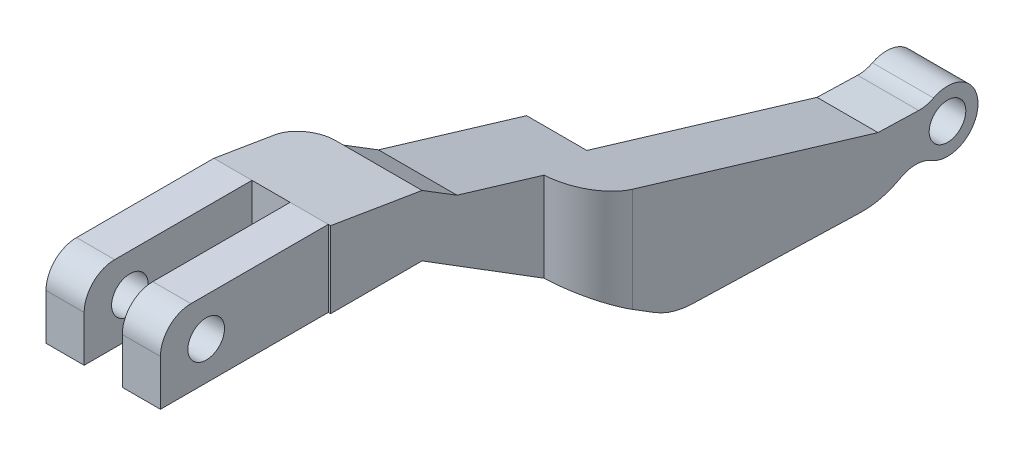
ISO-10303-21;
HEADER;
FILE_DESCRIPTION(('STEP AP214'),'2;1');
FILE_NAME('part.step','',(''),(''),'','','');
FILE_SCHEMA(('AUTOMOTIVE_DESIGN { 1 0 10303 214 1 1 1 1 }'));
ENDSEC;
DATA;
#1=APPLICATION_CONTEXT('core data for automotive mechanical design processes');
#2=APPLICATION_PROTOCOL_DEFINITION('international standard','automotive_design',2000,#1);
#3=PRODUCT_CONTEXT('',#1,'mechanical');
#4=PRODUCT('Part','Part','',(#3));
#5=PRODUCT_RELATED_PRODUCT_CATEGORY('part','',(#4));
#6=PRODUCT_DEFINITION_FORMATION('','',#4);
#7=PRODUCT_DEFINITION_CONTEXT('part definition',#1,'design');
#8=PRODUCT_DEFINITION('design','',#6,#7);
#9=PRODUCT_DEFINITION_SHAPE('','',#8);
#10=(LENGTH_UNIT() NAMED_UNIT(*) SI_UNIT(.MILLI.,.METRE.));
#11=(NAMED_UNIT(*) PLANE_ANGLE_UNIT() SI_UNIT($,.RADIAN.));
#12=(NAMED_UNIT(*) SI_UNIT($,.STERADIAN.) SOLID_ANGLE_UNIT());
#13=UNCERTAINTY_MEASURE_WITH_UNIT(LENGTH_MEASURE(1.E-05),#10,'distance_accuracy_value','');
#14=(GEOMETRIC_REPRESENTATION_CONTEXT(3) GLOBAL_UNCERTAINTY_ASSIGNED_CONTEXT((#13)) GLOBAL_UNIT_ASSIGNED_CONTEXT((#10,
#11,#12)) REPRESENTATION_CONTEXT('',''));
#15=CARTESIAN_POINT('',(0.,0.,0.));
#16=DIRECTION('',(0.,0.,1.));
#17=DIRECTION('',(1.,0.,0.));
#18=AXIS2_PLACEMENT_3D('',#15,#16,#17);
#19=CARTESIAN_POINT('',(-5.95,0.,0.));
#20=DIRECTION('',(-1.,0.,0.));
#21=DIRECTION('',(0.,0.,1.));
#22=AXIS2_PLACEMENT_3D('',#19,#20,#21);
#23=PLANE('',#22);
#24=DIRECTION('',(0.,-0.528778917000518,-0.848759599024223));
#25=VECTOR('',#24,1.);
#26=CARTESIAN_POINT('',(-5.95,-8.75515715939604,5.45448031013391));
#27=LINE('',#26,#25);
#28=CARTESIAN_POINT('',(-5.95,9.3176930361465,34.4637781320032));
#29=VERTEX_POINT('',#28);
#30=CARTESIAN_POINT('',(-5.95,4.69896609824937,27.0501148830047));
#31=VERTEX_POINT('',#30);
#32=EDGE_CURVE('E276',#29,#31,#27,.T.);
#33=ORIENTED_EDGE('',*,*,#32,.F.);
#34=DIRECTION('',(0.,1.,0.));
#35=VECTOR('',#34,1.);
#36=CARTESIAN_POINT('',(-5.95,0.,34.4637781320032));
#37=LINE('',#36,#35);
#38=CARTESIAN_POINT('',(-5.95,13.3176930361465,34.4637781320032));
#39=VERTEX_POINT('',#38);
#40=EDGE_CURVE('E523',#29,#39,#37,.T.);
#41=ORIENTED_EDGE('',*,*,#40,.T.);
#42=DIRECTION('',(0.,-0.525535679646446,-0.850771561242234));
#43=VECTOR('',#42,1.);
#44=CARTESIAN_POINT('',(-5.95,-5.76961842549239,3.56398882928632));
#45=LINE('',#44,#43);
#46=CARTESIAN_POINT('',(-5.95,11.9032897739303,32.1740495403473));
#47=VERTEX_POINT('',#46);
#48=EDGE_CURVE('E283',#39,#47,#45,.T.);
#49=ORIENTED_EDGE('',*,*,#48,.T.);
#50=DIRECTION('',(0.,-0.287432602525788,-0.957800866049542));
#51=VECTOR('',#50,1.);
#52=CARTESIAN_POINT('',(-5.95,11.9032897739303,32.1740495403473));
#53=LINE('',#52,#51);
#54=CARTESIAN_POINT('',(-5.95,8.98927217271034,22.4637781320032));
#55=VERTEX_POINT('',#54);
#56=EDGE_CURVE('E401',#47,#55,#53,.T.);
#57=ORIENTED_EDGE('',*,*,#56,.T.);
#58=DIRECTION('',(0.,-1.,0.));
#59=VECTOR('',#58,1.);
#60=CARTESIAN_POINT('',(-5.95,0.,22.4637781320032));
#61=LINE('',#60,#59);
#62=CARTESIAN_POINT('',(-5.95,7.24524489532204,22.4637781320032));
#63=VERTEX_POINT('',#62);
#64=EDGE_CURVE('E273',#55,#63,#61,.T.);
#65=ORIENTED_EDGE('',*,*,#64,.T.);
#66=CARTESIAN_POINT('',(-5.95,7.24524489532204,25.4637781320032));
#67=DIRECTION('',(-1.,0.,0.));
#68=DIRECTION('',(0.,0.,1.));
#69=AXIS2_PLACEMENT_3D('',#66,#67,#68);
#70=CIRCLE('',#69,3.);
#71=EDGE_CURVE('E424',#63,#31,#70,.T.);
#72=ORIENTED_EDGE('',*,*,#71,.T.);
#73=EDGE_LOOP('',(#33,#41,#49,#57,#65,#72));
#74=FACE_BOUND('',#73,.T.);
#75=ADVANCED_FACE('F45',(#74),#23,.T.);
#76=CARTESIAN_POINT('',(-2.,11.9032897739303,32.1740495403473));
#77=DIRECTION('',(0.,-0.957800866049542,0.287432602525788));
#78=DIRECTION('',(-1.,0.,0.));
#79=AXIS2_PLACEMENT_3D('',#76,#77,#78);
#80=PLANE('',#79);
#81=DIRECTION('',(0.,0.287432602525788,0.957800866049542));
#82=VECTOR('',#81,1.);
#83=CARTESIAN_POINT('',(-0.8,11.9032897739303,32.1740495403473));
#84=LINE('',#83,#82);
#85=CARTESIAN_POINT('',(-0.8,10.1896578174271,26.4637781320032));
#86=VERTEX_POINT('',#85);
#87=CARTESIAN_POINT('',(-0.8,11.9032897739303,32.1740495403473));
#88=VERTEX_POINT('',#87);
#89=EDGE_CURVE('E399',#86,#88,#84,.T.);
#90=ORIENTED_EDGE('',*,*,#89,.F.);
#91=CARTESIAN_POINT('',(-1.,9.29137145452073,23.470452222584));
#92=DIRECTION('',(0.,-0.957800866049542,0.287432602525788));
#93=DIRECTION('',(0.,0.287432602525788,0.957800866049542));
#94=AXIS2_PLACEMENT_3D('',#91,#92,#93);
#95=ELLIPSE('',#94,3.13217507557028,3.);
#96=CARTESIAN_POINT('',(2.,9.29137145452073,23.470452222584));
#97=VERTEX_POINT('',#96);
#98=EDGE_CURVE('E420',#86,#97,#95,.F.);
#99=ORIENTED_EDGE('',*,*,#98,.T.);
#100=DIRECTION('',(0.,0.287432602525788,0.957800866049542));
#101=VECTOR('',#100,1.);
#102=CARTESIAN_POINT('',(2.,11.9032897739303,32.1740495403473));
#103=LINE('',#102,#101);
#104=CARTESIAN_POINT('',(2.,4.46398660222472,7.3843389854166));
#105=VERTEX_POINT('',#104);
#106=EDGE_CURVE('E407',#97,#105,#103,.F.);
#107=ORIENTED_EDGE('',*,*,#106,.T.);
#108=DIRECTION('',(1.,0.,0.));
#109=VECTOR('',#108,1.);
#110=CARTESIAN_POINT('',(-2.,4.46398660222472,7.38433898541658));
#111=LINE('',#110,#109);
#112=CARTESIAN_POINT('',(-2.,4.46398660222472,7.3843389854166));
#113=VERTEX_POINT('',#112);
#114=EDGE_CURVE('E396',#113,#105,#111,.T.);
#115=ORIENTED_EDGE('',*,*,#114,.F.);
#116=DIRECTION('',(0.,-0.287432602525788,-0.957800866049542));
#117=VECTOR('',#116,1.);
#118=CARTESIAN_POINT('',(-2.,2.06225106437396,-0.61887414336909));
#119=LINE('',#118,#117);
#120=CARTESIAN_POINT('',(-2.,8.98927217271034,22.4637781320032));
#121=VERTEX_POINT('',#120);
#122=EDGE_CURVE('E409',#113,#121,#119,.F.);
#123=ORIENTED_EDGE('',*,*,#122,.T.);
#124=DIRECTION('',(1.,0.,0.));
#125=VECTOR('',#124,1.);
#126=CARTESIAN_POINT('',(-3.45,8.98927217271034,22.4637781320032));
#127=LINE('',#126,#125);
#128=EDGE_CURVE('E404',#55,#121,#127,.T.);
#129=ORIENTED_EDGE('',*,*,#128,.F.);
#130=ORIENTED_EDGE('',*,*,#56,.F.);
#131=DIRECTION('',(-1.,0.,0.));
#132=VECTOR('',#131,1.);
#133=CARTESIAN_POINT('',(-2.,11.9032897739303,32.1740495403473));
#134=LINE('',#133,#132);
#135=EDGE_CURVE('E393',#88,#47,#134,.T.);
#136=ORIENTED_EDGE('',*,*,#135,.F.);
#137=EDGE_LOOP('',(#90,#99,#107,#115,#123,#129,#130,#136));
#138=FACE_BOUND('',#137,.T.);
#139=ADVANCED_FACE('F532',(#138),#80,.F.);
#140=CARTESIAN_POINT('',(-2.,0.,0.));
#141=DIRECTION('',(1.,0.,0.));
#142=DIRECTION('',(0.,0.,-1.));
#143=AXIS2_PLACEMENT_3D('',#140,#141,#142);
#144=PLANE('',#143);
#145=CARTESIAN_POINT('',(-2.,2.82842712474617,2.82842712474621));
#146=DIRECTION('',(1.,0.,0.));
#147=DIRECTION('',(0.,0.,-1.));
#148=AXIS2_PLACEMENT_3D('',#145,#146,#147);
#149=CIRCLE('',#148,1.2);
#150=CARTESIAN_POINT('',(-2.,2.82842712474617,1.62842712474621));
#151=VERTEX_POINT('',#150);
#152=EDGE_CURVE('E381',#151,#151,#149,.T.);
#153=ORIENTED_EDGE('',*,*,#152,.T.);
#154=EDGE_LOOP('',(#153));
#155=FACE_BOUND('',#154,.T.);
#156=DIRECTION('',(0.,0.0297414685478298,0.999557624676346));
#157=VECTOR('',#156,1.);
#158=CARTESIAN_POINT('',(-2.,0.242283531335013,-0.00720905713584112));
#159=LINE('',#158,#157);
#160=CARTESIAN_POINT('',(-2.,0.496147983825629,8.52472166152389));
#161=VERTEX_POINT('',#160);
#162=CARTESIAN_POINT('',(-2.,0.824065904827044,19.5454571601043));
#163=VERTEX_POINT('',#162);
#164=EDGE_CURVE('E374',#161,#163,#159,.T.);
#165=ORIENTED_EDGE('',*,*,#164,.T.);
#166=CARTESIAN_POINT('',(-2.,5.82185402820877,19.3967498173651));
#167=DIRECTION('',(1.,0.,0.));
#168=DIRECTION('',(0.,0.,-1.));
#169=AXIS2_PLACEMENT_3D('',#166,#167,#168);
#170=CIRCLE('',#169,5.);
#171=CARTESIAN_POINT('',(-2.,1.57805603308766,22.0406444023677));
#172=VERTEX_POINT('',#171);
#173=EDGE_CURVE('E53',#163,#172,#170,.F.);
#174=ORIENTED_EDGE('',*,*,#173,.T.);
#175=DIRECTION('',(0.,-0.528778917000518,-0.848759599024223));
#176=VECTOR('',#175,1.);
#177=CARTESIAN_POINT('',(-2.,-8.75515715939604,5.45448031013391));
#178=LINE('',#177,#176);
#179=CARTESIAN_POINT('',(-2.,4.69896609824937,27.0501148830047));
#180=VERTEX_POINT('',#179);
#181=EDGE_CURVE('E371',#180,#172,#178,.T.);
#182=ORIENTED_EDGE('',*,*,#181,.F.);
#183=CARTESIAN_POINT('',(-2.,7.24524489532204,25.4637781320032));
#184=DIRECTION('',(1.,0.,0.));
#185=DIRECTION('',(0.,0.,-1.));
#186=AXIS2_PLACEMENT_3D('',#183,#184,#185);
#187=CIRCLE('',#186,3.);
#188=CARTESIAN_POINT('',(-2.,7.24524489532204,22.4637781320032));
#189=VERTEX_POINT('',#188);
#190=EDGE_CURVE('E426',#180,#189,#187,.T.);
#191=ORIENTED_EDGE('',*,*,#190,.T.);
#192=DIRECTION('',(0.,-1.,0.));
#193=VECTOR('',#192,1.);
#194=CARTESIAN_POINT('',(-2.,0.,22.4637781320032));
#195=LINE('',#194,#193);
#196=EDGE_CURVE('E387',#121,#189,#195,.T.);
#197=ORIENTED_EDGE('',*,*,#196,.F.);
#198=ORIENTED_EDGE('',*,*,#122,.F.);
#199=DIRECTION('',(0.,0.0297414685478318,0.999557624676346));
#200=VECTOR('',#199,1.);
#201=CARTESIAN_POINT('',(-2.,4.24051403004038,-0.126174931327168));
#202=LINE('',#201,#200);
#203=CARTESIAN_POINT('',(-2.,4.3847300535859,4.72066797771044));
#204=VERTEX_POINT('',#203);
#205=EDGE_CURVE('E368',#204,#113,#202,.T.);
#206=ORIENTED_EDGE('',*,*,#205,.F.);
#207=CARTESIAN_POINT('',(-2.,6.38384530293859,4.66118504061478));
#208=DIRECTION('',(1.,0.,0.));
#209=DIRECTION('',(0.,0.,-1.));
#210=AXIS2_PLACEMENT_3D('',#207,#208,#209);
#211=CIRCLE('',#210,2.);
#212=CARTESIAN_POINT('',(-2.,4.60613621384238,3.74480608268049));
#213=VERTEX_POINT('',#212);
#214=EDGE_CURVE('E366',#204,#213,#211,.T.);
#215=ORIENTED_EDGE('',*,*,#214,.T.);
#216=CARTESIAN_POINT('',(-2.,2.82842712474617,2.82842712474621));
#217=DIRECTION('',(1.,0.,0.));
#218=DIRECTION('',(0.,0.,-1.));
#219=AXIS2_PLACEMENT_3D('',#216,#217,#218);
#220=CIRCLE('',#219,2.);
#221=CARTESIAN_POINT('',(-2.,1.12045558993341,3.86901985788888));
#222=VERTEX_POINT('',#221);
#223=EDGE_CURVE('E378',#222,#213,#220,.T.);
#224=ORIENTED_EDGE('',*,*,#223,.F.);
#225=CARTESIAN_POINT('',(-2.,-0.587515944879356,4.90961259103154));
#226=DIRECTION('',(1.,0.,0.));
#227=DIRECTION('',(0.,0.,-1.));
#228=AXIS2_PLACEMENT_3D('',#225,#226,#227);
#229=CIRCLE('',#228,2.);
#230=CARTESIAN_POINT('',(-2.,1.15004178428828,5.90001308467531));
#231=VERTEX_POINT('',#230);
#232=EDGE_CURVE('E376',#222,#231,#229,.T.);
#233=ORIENTED_EDGE('',*,*,#232,.T.);
#234=CARTESIAN_POINT('',(-2.,5.49393610720736,8.37601431878474));
#235=DIRECTION('',(1.,0.,0.));
#236=DIRECTION('',(0.,0.,-1.));
#237=AXIS2_PLACEMENT_3D('',#234,#235,#236);
#238=CIRCLE('',#237,5.);
#239=EDGE_CURVE('E463',#231,#161,#238,.F.);
#240=ORIENTED_EDGE('',*,*,#239,.T.);
#241=EDGE_LOOP('',(#165,#174,#182,#191,#197,#198,#206,#215,#224,#233,#240));
#242=FACE_BOUND('',#241,.T.);
#243=ADVANCED_FACE('F466',(#155,#242),#144,.F.);
#244=CARTESIAN_POINT('',(-2.,6.38384530293859,4.66118504061478));
#245=DIRECTION('',(1.,0.,0.));
#246=DIRECTION('',(0.,0.,-1.));
#247=AXIS2_PLACEMENT_3D('',#244,#245,#246);
#248=CYLINDRICAL_SURFACE('',#247,2.);
#249=DIRECTION('',(1.,0.,0.));
#250=VECTOR('',#249,1.);
#251=CARTESIAN_POINT('',(-2.,4.3847300535859,4.72066797771044));
#252=LINE('',#251,#250);
#253=CARTESIAN_POINT('',(2.,4.3847300535859,4.72066797771044));
#254=VERTEX_POINT('',#253);
#255=EDGE_CURVE('E384',#204,#254,#252,.T.);
#256=ORIENTED_EDGE('',*,*,#255,.T.);
#257=CARTESIAN_POINT('',(2.,6.38384530293859,4.66118504061478));
#258=DIRECTION('',(1.,0.,0.));
#259=DIRECTION('',(0.,0.,-1.));
#260=AXIS2_PLACEMENT_3D('',#257,#258,#259);
#261=CIRCLE('',#260,2.);
#262=CARTESIAN_POINT('',(2.,4.60613621384238,3.74480608268049));
#263=VERTEX_POINT('',#262);
#264=EDGE_CURVE('E347',#254,#263,#261,.T.);
#265=ORIENTED_EDGE('',*,*,#264,.T.);
#266=DIRECTION('',(1.,0.,0.));
#267=VECTOR('',#266,1.);
#268=CARTESIAN_POINT('',(-2.,4.60613621384238,3.74480608268049));
#269=LINE('',#268,#267);
#270=EDGE_CURVE('E385',#213,#263,#269,.T.);
#271=ORIENTED_EDGE('',*,*,#270,.F.);
#272=ORIENTED_EDGE('',*,*,#214,.F.);
#273=EDGE_LOOP('',(#256,#265,#271,#272));
#274=FACE_BOUND('',#273,.T.);
#275=ADVANCED_FACE('F492',(#274),#248,.F.);
#276=CARTESIAN_POINT('',(-2.,2.82842712474617,2.82842712474621));
#277=DIRECTION('',(1.,0.,0.));
#278=DIRECTION('',(0.,0.,-1.));
#279=AXIS2_PLACEMENT_3D('',#276,#277,#278);
#280=CYLINDRICAL_SURFACE('',#279,2.);
#281=ORIENTED_EDGE('',*,*,#270,.T.);
#282=CARTESIAN_POINT('',(2.,2.82842712474617,2.82842712474621));
#283=DIRECTION('',(1.,0.,0.));
#284=DIRECTION('',(0.,0.,-1.));
#285=AXIS2_PLACEMENT_3D('',#282,#283,#284);
#286=CIRCLE('',#285,2.);
#287=CARTESIAN_POINT('',(2.,1.12045558993341,3.86901985788888));
#288=VERTEX_POINT('',#287);
#289=EDGE_CURVE('E360',#288,#263,#286,.T.);
#290=ORIENTED_EDGE('',*,*,#289,.F.);
#291=DIRECTION('',(1.,0.,0.));
#292=VECTOR('',#291,1.);
#293=CARTESIAN_POINT('',(-2.,1.12045558993341,3.86901985788888));
#294=LINE('',#293,#292);
#295=EDGE_CURVE('E388',#222,#288,#294,.T.);
#296=ORIENTED_EDGE('',*,*,#295,.F.);
#297=ORIENTED_EDGE('',*,*,#223,.T.);
#298=EDGE_LOOP('',(#281,#290,#296,#297));
#299=FACE_BOUND('',#298,.T.);
#300=ADVANCED_FACE('F488',(#299),#280,.T.);
#301=CARTESIAN_POINT('',(-2.,-0.587515944879356,4.90961259103154));
#302=DIRECTION('',(1.,0.,0.));
#303=DIRECTION('',(0.,0.,-1.));
#304=AXIS2_PLACEMENT_3D('',#301,#302,#303);
#305=CYLINDRICAL_SURFACE('',#304,2.);
#306=CARTESIAN_POINT('',(2.,-0.587515944879356,4.90961259103154));
#307=DIRECTION('',(1.,0.,0.));
#308=DIRECTION('',(0.,0.,-1.));
#309=AXIS2_PLACEMENT_3D('',#306,#307,#308);
#310=CIRCLE('',#309,2.);
#311=CARTESIAN_POINT('',(2.,1.15004178428828,5.90001308467531));
#312=VERTEX_POINT('',#311);
#313=EDGE_CURVE('E358',#288,#312,#310,.T.);
#314=ORIENTED_EDGE('',*,*,#313,.T.);
#315=DIRECTION('',(1.,0.,0.));
#316=VECTOR('',#315,1.);
#317=CARTESIAN_POINT('',(-2.,1.15004178428828,5.90001308467531));
#318=LINE('',#317,#316);
#319=EDGE_CURVE('E12',#312,#231,#318,.F.);
#320=ORIENTED_EDGE('',*,*,#319,.T.);
#321=ORIENTED_EDGE('',*,*,#232,.F.);
#322=ORIENTED_EDGE('',*,*,#295,.T.);
#323=EDGE_LOOP('',(#314,#320,#321,#322));
#324=FACE_BOUND('',#323,.T.);
#325=ADVANCED_FACE('F484',(#324),#305,.F.);
#326=CARTESIAN_POINT('',(-2.,0.242283531335013,-0.00720905713584112));
#327=DIRECTION('',(0.,0.999557624676346,-0.0297414685478298));
#328=DIRECTION('',(0.,0.0297414685478298,0.999557624676346));
#329=AXIS2_PLACEMENT_3D('',#326,#327,#328);
#330=PLANE('',#329);
#331=DIRECTION('',(0.,0.0297414685478298,0.999557624676346));
#332=VECTOR('',#331,1.);
#333=CARTESIAN_POINT('',(2.,0.242283531335013,-0.00720905713584112));
#334=LINE('',#333,#332);
#335=CARTESIAN_POINT('',(2.,0.496147983825629,8.52472166152389));
#336=VERTEX_POINT('',#335);
#337=CARTESIAN_POINT('',(2.,0.824065904827044,19.5454571601043));
#338=VERTEX_POINT('',#337);
#339=EDGE_CURVE('E356',#336,#338,#334,.T.);
#340=ORIENTED_EDGE('',*,*,#339,.T.);
#341=DIRECTION('',(1.,0.,0.));
#342=VECTOR('',#341,1.);
#343=CARTESIAN_POINT('',(-2.,0.824065904827044,19.5454571601043));
#344=LINE('',#343,#342);
#345=EDGE_CURVE('E66',#338,#163,#344,.F.);
#346=ORIENTED_EDGE('',*,*,#345,.T.);
#347=ORIENTED_EDGE('',*,*,#164,.F.);
#348=DIRECTION('',(1.,0.,0.));
#349=VECTOR('',#348,1.);
#350=CARTESIAN_POINT('',(-2.,0.496147983825629,8.52472166152389));
#351=LINE('',#350,#349);
#352=EDGE_CURVE('E459',#161,#336,#351,.T.);
#353=ORIENTED_EDGE('',*,*,#352,.T.);
#354=EDGE_LOOP('',(#340,#346,#347,#353));
#355=FACE_BOUND('',#354,.T.);
#356=ADVANCED_FACE('F479',(#355),#330,.F.);
#357=CARTESIAN_POINT('',(-2.,-8.75515715939604,5.45448031013391));
#358=DIRECTION('',(0.,-0.848759599024222,0.528778917000518));
#359=DIRECTION('',(0.,-0.528778917000518,-0.848759599024223));
#360=AXIS2_PLACEMENT_3D('',#357,#358,#359);
#361=PLANE('',#360);
#362=ORIENTED_EDGE('',*,*,#181,.T.);
#363=DIRECTION('',(1.,0.,0.));
#364=VECTOR('',#363,1.);
#365=CARTESIAN_POINT('',(2.,1.57805603308766,22.0406444023677));
#366=LINE('',#365,#364);
#367=CARTESIAN_POINT('',(2.,1.57805603308766,22.0406444023677));
#368=VERTEX_POINT('',#367);
#369=EDGE_CURVE('E452',#172,#368,#366,.T.);
#370=ORIENTED_EDGE('',*,*,#369,.T.);
#371=DIRECTION('',(0.,-0.528778917000518,-0.848759599024223));
#372=VECTOR('',#371,1.);
#373=CARTESIAN_POINT('',(2.,-8.75515715939604,5.45448031013391));
#374=LINE('',#373,#372);
#375=CARTESIAN_POINT('',(2.,2.46882914665487,23.470452222584));
#376=VERTEX_POINT('',#375);
#377=EDGE_CURVE('E353',#376,#368,#374,.T.);
#378=ORIENTED_EDGE('',*,*,#377,.F.);
#379=CARTESIAN_POINT('',(-1.,2.46882914665487,23.470452222584));
#380=DIRECTION('',(0.,-0.848759599024222,0.528778917000518));
#381=DIRECTION('',(0.,0.528778917000518,0.848759599024223));
#382=AXIS2_PLACEMENT_3D('',#379,#380,#381);
#383=ELLIPSE('',#382,3.53456974560164,3.);
#384=CARTESIAN_POINT('',(-0.8,4.33367713710107,26.4637781320032));
#385=VERTEX_POINT('',#384);
#386=EDGE_CURVE('E418',#376,#385,#383,.T.);
#387=ORIENTED_EDGE('',*,*,#386,.T.);
#388=DIRECTION('',(0.,-0.528778917000518,-0.848759599024223));
#389=VECTOR('',#388,1.);
#390=CARTESIAN_POINT('',(-0.8,-8.75515715939604,5.45448031013391));
#391=LINE('',#390,#389);
#392=CARTESIAN_POINT('',(-0.8,9.3176930361465,34.4637781320032));
#393=VERTEX_POINT('',#392);
#394=EDGE_CURVE('E338',#393,#385,#391,.T.);
#395=ORIENTED_EDGE('',*,*,#394,.F.);
#396=DIRECTION('',(1.,0.,0.));
#397=VECTOR('',#396,1.);
#398=CARTESIAN_POINT('',(-3.45,9.3176930361465,34.4637781320032));
#399=LINE('',#398,#397);
#400=EDGE_CURVE('E342',#29,#393,#399,.T.);
#401=ORIENTED_EDGE('',*,*,#400,.F.);
#402=ORIENTED_EDGE('',*,*,#32,.T.);
#403=DIRECTION('',(1.,0.,0.));
#404=VECTOR('',#403,1.);
#405=CARTESIAN_POINT('',(-2.,4.69896609824937,27.0501148830047));
#406=LINE('',#405,#404);
#407=EDGE_CURVE('E415',#31,#180,#406,.T.);
#408=ORIENTED_EDGE('',*,*,#407,.T.);
#409=EDGE_LOOP('',(#362,#370,#378,#387,#395,#401,#402,#408));
#410=FACE_BOUND('',#409,.T.);
#411=ADVANCED_FACE('F471',(#410),#361,.T.);
#412=CARTESIAN_POINT('',(-2.,-5.76961842549239,3.56398882928632));
#413=DIRECTION('',(0.,-0.850771561242234,0.525535679646446));
#414=DIRECTION('',(0.,-0.525535679646446,-0.850771561242234));
#415=AXIS2_PLACEMENT_3D('',#412,#413,#414);
#416=PLANE('',#415);
#417=DIRECTION('',(0.,-0.525535679646446,-0.850771561242234));
#418=VECTOR('',#417,1.);
#419=CARTESIAN_POINT('',(-0.8,-5.76961842549239,3.56398882928632));
#420=LINE('',#419,#418);
#421=CARTESIAN_POINT('',(-0.8,13.3176930361465,34.4637781320032));
#422=VERTEX_POINT('',#421);
#423=EDGE_CURVE('E335',#422,#88,#420,.T.);
#424=ORIENTED_EDGE('',*,*,#423,.T.);
#425=ORIENTED_EDGE('',*,*,#135,.T.);
#426=ORIENTED_EDGE('',*,*,#48,.F.);
#427=DIRECTION('',(1.,0.,0.));
#428=VECTOR('',#427,1.);
#429=CARTESIAN_POINT('',(-3.45,13.3176930361465,34.4637781320032));
#430=LINE('',#429,#428);
#431=EDGE_CURVE('E341',#39,#422,#430,.T.);
#432=ORIENTED_EDGE('',*,*,#431,.T.);
#433=EDGE_LOOP('',(#424,#425,#426,#432));
#434=FACE_BOUND('',#433,.T.);
#435=ADVANCED_FACE('F536',(#434),#416,.F.);
#436=CARTESIAN_POINT('',(-2.,4.24051403004038,-0.126174931327168));
#437=DIRECTION('',(0.,0.999557624676346,-0.0297414685478317));
#438=DIRECTION('',(0.,0.0297414685478317,0.999557624676346));
#439=AXIS2_PLACEMENT_3D('',#436,#437,#438);
#440=PLANE('',#439);
#441=ORIENTED_EDGE('',*,*,#205,.T.);
#442=ORIENTED_EDGE('',*,*,#114,.T.);
#443=DIRECTION('',(0.,0.0297414685478318,0.999557624676346));
#444=VECTOR('',#443,1.);
#445=CARTESIAN_POINT('',(2.,4.24051403004038,-0.126174931327168));
#446=LINE('',#445,#444);
#447=EDGE_CURVE('E350',#254,#105,#446,.T.);
#448=ORIENTED_EDGE('',*,*,#447,.F.);
#449=ORIENTED_EDGE('',*,*,#255,.F.);
#450=EDGE_LOOP('',(#441,#442,#448,#449));
#451=FACE_BOUND('',#450,.T.);
#452=ADVANCED_FACE('F497',(#451),#440,.T.);
#453=CARTESIAN_POINT('',(-2.,2.82842712474617,2.82842712474621));
#454=DIRECTION('',(1.,0.,0.));
#455=DIRECTION('',(0.,0.,-1.));
#456=AXIS2_PLACEMENT_3D('',#453,#454,#455);
#457=CYLINDRICAL_SURFACE('',#456,1.2);
#458=ORIENTED_EDGE('',*,*,#152,.F.);
#459=EDGE_LOOP('',(#458));
#460=FACE_BOUND('',#459,.T.);
#461=CARTESIAN_POINT('',(2.,2.82842712474617,2.82842712474621));
#462=DIRECTION('',(1.,0.,0.));
#463=DIRECTION('',(0.,0.,-1.));
#464=AXIS2_PLACEMENT_3D('',#461,#462,#463);
#465=CIRCLE('',#464,1.2);
#466=CARTESIAN_POINT('',(2.,2.82842712474617,1.62842712474621));
#467=VERTEX_POINT('',#466);
#468=EDGE_CURVE('E363',#467,#467,#465,.T.);
#469=ORIENTED_EDGE('',*,*,#468,.T.);
#470=EDGE_LOOP('',(#469));
#471=FACE_BOUND('',#470,.T.);
#472=ADVANCED_FACE('F632',(#460,#471),#457,.F.);
#473=CARTESIAN_POINT('',(2.,0.,0.));
#474=DIRECTION('',(1.,0.,0.));
#475=DIRECTION('',(0.,0.,-1.));
#476=AXIS2_PLACEMENT_3D('',#473,#474,#475);
#477=PLANE('',#476);
#478=ORIENTED_EDGE('',*,*,#377,.T.);
#479=CARTESIAN_POINT('',(2.,5.82185402820877,19.3967498173651));
#480=DIRECTION('',(1.,0.,0.));
#481=DIRECTION('',(0.,0.,-1.));
#482=AXIS2_PLACEMENT_3D('',#479,#480,#481);
#483=CIRCLE('',#482,5.);
#484=EDGE_CURVE('E457',#368,#338,#483,.T.);
#485=ORIENTED_EDGE('',*,*,#484,.T.);
#486=ORIENTED_EDGE('',*,*,#339,.F.);
#487=CARTESIAN_POINT('',(2.,5.49393610720736,8.37601431878474));
#488=DIRECTION('',(1.,0.,0.));
#489=DIRECTION('',(0.,0.,-1.));
#490=AXIS2_PLACEMENT_3D('',#487,#488,#489);
#491=CIRCLE('',#490,5.);
#492=EDGE_CURVE('E455',#336,#312,#491,.T.);
#493=ORIENTED_EDGE('',*,*,#492,.T.);
#494=ORIENTED_EDGE('',*,*,#313,.F.);
#495=ORIENTED_EDGE('',*,*,#289,.T.);
#496=ORIENTED_EDGE('',*,*,#264,.F.);
#497=ORIENTED_EDGE('',*,*,#447,.T.);
#498=ORIENTED_EDGE('',*,*,#106,.F.);
#499=DIRECTION('',(0.,-1.,0.));
#500=VECTOR('',#499,1.);
#501=CARTESIAN_POINT('',(2.,4.33367713710107,23.470452222584));
#502=LINE('',#501,#500);
#503=EDGE_CURVE('E412',#97,#376,#502,.T.);
#504=ORIENTED_EDGE('',*,*,#503,.T.);
#505=EDGE_LOOP('',(#478,#485,#486,#493,#494,#495,#496,#497,#498,#504));
#506=FACE_BOUND('',#505,.T.);
#507=ORIENTED_EDGE('',*,*,#468,.F.);
#508=EDGE_LOOP('',(#507));
#509=FACE_BOUND('',#508,.T.);
#510=ADVANCED_FACE('F477',(#506,#509),#477,.T.);
#511=CARTESIAN_POINT('',(-3.45,0.,22.4637781320032));
#512=DIRECTION('',(0.,0.,1.));
#513=DIRECTION('',(0.,-1.,0.));
#514=AXIS2_PLACEMENT_3D('',#511,#512,#513);
#515=PLANE('',#514);
#516=ORIENTED_EDGE('',*,*,#196,.T.);
#517=DIRECTION('',(1.,0.,0.));
#518=VECTOR('',#517,1.);
#519=CARTESIAN_POINT('',(-5.95,7.24524489532204,22.4637781320032));
#520=LINE('',#519,#518);
#521=EDGE_CURVE('E422',#189,#63,#520,.F.);
#522=ORIENTED_EDGE('',*,*,#521,.T.);
#523=ORIENTED_EDGE('',*,*,#64,.F.);
#524=ORIENTED_EDGE('',*,*,#128,.T.);
#525=EDGE_LOOP('',(#516,#522,#523,#524));
#526=FACE_BOUND('',#525,.T.);
#527=ADVANCED_FACE('F530',(#526),#515,.F.);
#528=CARTESIAN_POINT('',(-3.45,0.,0.));
#529=DIRECTION('',(1.,0.,0.));
#530=DIRECTION('',(0.,0.,-1.));
#531=AXIS2_PLACEMENT_3D('',#528,#529,#530);
#532=PLANE('',#531);
#533=DIRECTION('',(0.,-1.,0.));
#534=VECTOR('',#533,1.);
#535=CARTESIAN_POINT('',(-3.45,0.,51.4637781320032));
#536=LINE('',#535,#534);
#537=CARTESIAN_POINT('',(-3.45,12.3176930361465,51.4637781320032));
#538=VERTEX_POINT('',#537);
#539=CARTESIAN_POINT('',(-3.45,9.3176930361465,51.4637781320032));
#540=VERTEX_POINT('',#539);
#541=EDGE_CURVE('E296',#538,#540,#536,.T.);
#542=ORIENTED_EDGE('',*,*,#541,.F.);
#543=CARTESIAN_POINT('',(-3.45,12.3176930361465,49.4637781320032));
#544=DIRECTION('',(1.,0.,0.));
#545=DIRECTION('',(0.,0.,-1.));
#546=AXIS2_PLACEMENT_3D('',#543,#544,#545);
#547=CIRCLE('',#546,2.);
#548=CARTESIAN_POINT('',(-3.45,14.3176930361465,49.4637781320032));
#549=VERTEX_POINT('',#548);
#550=EDGE_CURVE('E440',#538,#549,#547,.F.);
#551=ORIENTED_EDGE('',*,*,#550,.T.);
#552=DIRECTION('',(0.,0.,1.));
#553=VECTOR('',#552,1.);
#554=CARTESIAN_POINT('',(-3.45,14.3176930361465,0.));
#555=LINE('',#554,#553);
#556=CARTESIAN_POINT('',(-3.45,14.3176930361465,40.4637781320032));
#557=VERTEX_POINT('',#556);
#558=EDGE_CURVE('E303',#557,#549,#555,.T.);
#559=ORIENTED_EDGE('',*,*,#558,.F.);
#560=DIRECTION('',(0.,-1.,0.));
#561=VECTOR('',#560,1.);
#562=CARTESIAN_POINT('',(-3.45,0.,40.4637781320032));
#563=LINE('',#562,#561);
#564=CARTESIAN_POINT('',(-3.45,9.3176930361465,40.4637781320032));
#565=VERTEX_POINT('',#564);
#566=EDGE_CURVE('E277',#557,#565,#563,.T.);
#567=ORIENTED_EDGE('',*,*,#566,.T.);
#568=DIRECTION('',(0.,0.,1.));
#569=VECTOR('',#568,1.);
#570=CARTESIAN_POINT('',(-3.45,9.3176930361465,0.));
#571=LINE('',#570,#569);
#572=EDGE_CURVE('E318',#565,#540,#571,.T.);
#573=ORIENTED_EDGE('',*,*,#572,.T.);
#574=EDGE_LOOP('',(#542,#551,#559,#567,#573));
#575=FACE_BOUND('',#574,.T.);
#576=CARTESIAN_POINT('',(-3.45,11.8176930361465,48.4637781320032));
#577=DIRECTION('',(1.,0.,0.));
#578=DIRECTION('',(0.,0.,-1.));
#579=AXIS2_PLACEMENT_3D('',#576,#577,#578);
#580=CIRCLE('',#579,1.2);
#581=CARTESIAN_POINT('',(-3.45,11.8176930361465,47.2637781320032));
#582=VERTEX_POINT('',#581);
#583=EDGE_CURVE('E292',#582,#582,#580,.T.);
#584=ORIENTED_EDGE('',*,*,#583,.T.);
#585=EDGE_LOOP('',(#584));
#586=FACE_BOUND('',#585,.T.);
#587=ADVANCED_FACE('F555',(#575,#586),#532,.F.);
#588=CARTESIAN_POINT('',(-0.8,0.,0.));
#589=DIRECTION('',(1.,0.,0.));
#590=DIRECTION('',(0.,0.,-1.));
#591=AXIS2_PLACEMENT_3D('',#588,#589,#590);
#592=PLANE('',#591);
#593=ORIENTED_EDGE('',*,*,#394,.T.);
#594=DIRECTION('',(0.,1.,0.));
#595=VECTOR('',#594,1.);
#596=CARTESIAN_POINT('',(-0.8,0.,26.4637781320032));
#597=LINE('',#596,#595);
#598=EDGE_CURVE('E344',#385,#86,#597,.T.);
#599=ORIENTED_EDGE('',*,*,#598,.T.);
#600=ORIENTED_EDGE('',*,*,#89,.T.);
#601=ORIENTED_EDGE('',*,*,#423,.F.);
#602=DIRECTION('',(0.,-0.164398987305358,-0.986393923832144));
#603=VECTOR('',#602,1.);
#604=CARTESIAN_POINT('',(-0.8,7.3690346083582,-1.22817243472637));
#605=LINE('',#604,#603);
#606=CARTESIAN_POINT('',(-0.8,14.3176930361465,40.4637781320032));
#607=VERTEX_POINT('',#606);
#608=EDGE_CURVE('E322',#607,#422,#605,.T.);
#609=ORIENTED_EDGE('',*,*,#608,.F.);
#610=DIRECTION('',(0.,-1.,0.));
#611=VECTOR('',#610,1.);
#612=CARTESIAN_POINT('',(-0.8,0.,40.4637781320032));
#613=LINE('',#612,#611);
#614=CARTESIAN_POINT('',(-0.8,9.3176930361465,40.4637781320032));
#615=VERTEX_POINT('',#614);
#616=EDGE_CURVE('E325',#607,#615,#613,.T.);
#617=ORIENTED_EDGE('',*,*,#616,.T.);
#618=DIRECTION('',(0.,0.,1.));
#619=VECTOR('',#618,1.);
#620=CARTESIAN_POINT('',(-0.8,9.3176930361465,0.));
#621=LINE('',#620,#619);
#622=EDGE_CURVE('E317',#393,#615,#621,.T.);
#623=ORIENTED_EDGE('',*,*,#622,.F.);
#624=EDGE_LOOP('',(#593,#599,#600,#601,#609,#617,#623));
#625=FACE_BOUND('',#624,.T.);
#626=ADVANCED_FACE('F510',(#625),#592,.T.);
#627=CARTESIAN_POINT('',(-3.45,9.3176930361465,0.));
#628=DIRECTION('',(0.,1.,0.));
#629=DIRECTION('',(0.,0.,1.));
#630=AXIS2_PLACEMENT_3D('',#627,#628,#629);
#631=PLANE('',#630);
#632=DIRECTION('',(0.,0.,1.));
#633=VECTOR('',#632,1.);
#634=CARTESIAN_POINT('',(-8.45,9.3176930361465,0.));
#635=LINE('',#634,#633);
#636=CARTESIAN_POINT('',(-8.45,9.3176930361465,36.4637781320032));
#637=VERTEX_POINT('',#636);
#638=CARTESIAN_POINT('',(-8.45,9.3176930361465,51.4637781320032));
#639=VERTEX_POINT('',#638);
#640=EDGE_CURVE('E269',#637,#639,#635,.T.);
#641=ORIENTED_EDGE('',*,*,#640,.F.);
#642=CARTESIAN_POINT('',(-6.45,9.3176930361465,36.4637781320032));
#643=DIRECTION('',(0.,1.,0.));
#644=DIRECTION('',(0.,0.,1.));
#645=AXIS2_PLACEMENT_3D('',#642,#643,#644);
#646=CIRCLE('',#645,2.);
#647=CARTESIAN_POINT('',(-6.45,9.3176930361465,34.4637781320032));
#648=VERTEX_POINT('',#647);
#649=EDGE_CURVE('E435',#637,#648,#646,.F.);
#650=ORIENTED_EDGE('',*,*,#649,.T.);
#651=DIRECTION('',(1.,0.,0.));
#652=VECTOR('',#651,1.);
#653=CARTESIAN_POINT('',(-8.45,9.3176930361465,34.4637781320032));
#654=LINE('',#653,#652);
#655=EDGE_CURVE('E267',#648,#29,#654,.T.);
#656=ORIENTED_EDGE('',*,*,#655,.T.);
#657=ORIENTED_EDGE('',*,*,#400,.T.);
#658=ORIENTED_EDGE('',*,*,#622,.T.);
#659=DIRECTION('',(1.,0.,0.));
#660=VECTOR('',#659,1.);
#661=CARTESIAN_POINT('',(-3.45,9.3176930361465,40.4637781320032));
#662=LINE('',#661,#660);
#663=CARTESIAN_POINT('',(-0.95,9.3176930361465,40.4637781320032));
#664=VERTEX_POINT('',#663);
#665=EDGE_CURVE('E333',#664,#615,#662,.T.);
#666=ORIENTED_EDGE('',*,*,#665,.F.);
#667=DIRECTION('',(0.,0.,1.));
#668=VECTOR('',#667,1.);
#669=CARTESIAN_POINT('',(-0.95,9.3176930361465,0.));
#670=LINE('',#669,#668);
#671=CARTESIAN_POINT('',(-0.95,9.3176930361465,51.4637781320032));
#672=VERTEX_POINT('',#671);
#673=EDGE_CURVE('E299',#664,#672,#670,.T.);
#674=ORIENTED_EDGE('',*,*,#673,.T.);
#675=DIRECTION('',(-1.,0.,0.));
#676=VECTOR('',#675,1.);
#677=CARTESIAN_POINT('',(-0.95,9.3176930361465,51.4637781320032));
#678=LINE('',#677,#676);
#679=EDGE_CURVE('E308',#672,#540,#678,.T.);
#680=ORIENTED_EDGE('',*,*,#679,.T.);
#681=ORIENTED_EDGE('',*,*,#572,.F.);
#682=DIRECTION('',(1.,0.,0.));
#683=VECTOR('',#682,1.);
#684=CARTESIAN_POINT('',(-5.95,9.3176930361465,40.4637781320032));
#685=LINE('',#684,#683);
#686=CARTESIAN_POINT('',(-5.95,9.3176930361465,40.4637781320032));
#687=VERTEX_POINT('',#686);
#688=EDGE_CURVE('E290',#687,#565,#685,.T.);
#689=ORIENTED_EDGE('',*,*,#688,.F.);
#690=DIRECTION('',(0.,0.,1.));
#691=VECTOR('',#690,1.);
#692=CARTESIAN_POINT('',(-5.95,9.3176930361465,0.));
#693=LINE('',#692,#691);
#694=CARTESIAN_POINT('',(-5.95,9.3176930361465,51.4637781320032));
#695=VERTEX_POINT('',#694);
#696=EDGE_CURVE('E257',#687,#695,#693,.T.);
#697=ORIENTED_EDGE('',*,*,#696,.T.);
#698=DIRECTION('',(1.,0.,0.));
#699=VECTOR('',#698,1.);
#700=CARTESIAN_POINT('',(-8.45,9.3176930361465,51.4637781320032));
#701=LINE('',#700,#699);
#702=EDGE_CURVE('E263',#639,#695,#701,.T.);
#703=ORIENTED_EDGE('',*,*,#702,.F.);
#704=EDGE_LOOP('',(#641,#650,#656,#657,#658,#666,#674,#680,#681,#689,#697,#703));
#705=FACE_BOUND('',#704,.T.);
#706=ADVANCED_FACE('F517',(#705),#631,.F.);
#707=CARTESIAN_POINT('',(-3.45,0.,40.4637781320032));
#708=DIRECTION('',(0.,0.,1.));
#709=DIRECTION('',(0.,-1.,0.));
#710=AXIS2_PLACEMENT_3D('',#707,#708,#709);
#711=PLANE('',#710);
#712=DIRECTION('',(0.,1.,0.));
#713=VECTOR('',#712,1.);
#714=CARTESIAN_POINT('',(-0.95,0.,40.4637781320032));
#715=LINE('',#714,#713);
#716=CARTESIAN_POINT('',(-0.95,14.3176930361465,40.4637781320032));
#717=VERTEX_POINT('',#716);
#718=EDGE_CURVE('E314',#664,#717,#715,.T.);
#719=ORIENTED_EDGE('',*,*,#718,.F.);
#720=ORIENTED_EDGE('',*,*,#665,.T.);
#721=ORIENTED_EDGE('',*,*,#616,.F.);
#722=DIRECTION('',(1.,0.,0.));
#723=VECTOR('',#722,1.);
#724=CARTESIAN_POINT('',(-3.45,14.3176930361465,40.4637781320032));
#725=LINE('',#724,#723);
#726=EDGE_CURVE('E321',#717,#607,#725,.T.);
#727=ORIENTED_EDGE('',*,*,#726,.F.);
#728=EDGE_LOOP('',(#719,#720,#721,#727));
#729=FACE_BOUND('',#728,.T.);
#730=ADVANCED_FACE('F542',(#729),#711,.T.);
#731=CARTESIAN_POINT('',(-3.45,7.3690346083582,-1.22817243472637));
#732=DIRECTION('',(0.,-0.986393923832144,0.164398987305358));
#733=DIRECTION('',(0.,-0.164398987305358,-0.986393923832144));
#734=AXIS2_PLACEMENT_3D('',#731,#732,#733);
#735=PLANE('',#734);
#736=DIRECTION('',(1.,0.,0.));
#737=VECTOR('',#736,1.);
#738=CARTESIAN_POINT('',(-8.45,13.3176930361465,34.4637781320032));
#739=LINE('',#738,#737);
#740=CARTESIAN_POINT('',(-6.45,13.3176930361465,34.4637781320032));
#741=VERTEX_POINT('',#740);
#742=EDGE_CURVE('E264',#741,#39,#739,.T.);
#743=ORIENTED_EDGE('',*,*,#742,.F.);
#744=CARTESIAN_POINT('',(-6.45,13.6510263694798,36.4637781320032));
#745=DIRECTION('',(0.,-0.986393923832144,0.164398987305358));
#746=DIRECTION('',(0.,0.164398987305358,0.986393923832144));
#747=AXIS2_PLACEMENT_3D('',#744,#745,#746);
#748=ELLIPSE('',#747,2.02758751009941,2.);
#749=CARTESIAN_POINT('',(-8.45,13.6510263694798,36.4637781320032));
#750=VERTEX_POINT('',#749);
#751=EDGE_CURVE('E256',#741,#750,#748,.F.);
#752=ORIENTED_EDGE('',*,*,#751,.T.);
#753=DIRECTION('',(0.,0.164398987305358,0.986393923832144));
#754=VECTOR('',#753,1.);
#755=CARTESIAN_POINT('',(-8.45,7.3690346083582,-1.22817243472637));
#756=LINE('',#755,#754);
#757=CARTESIAN_POINT('',(-8.45,14.3176930361465,40.4637781320032));
#758=VERTEX_POINT('',#757);
#759=EDGE_CURVE('E239',#750,#758,#756,.T.);
#760=ORIENTED_EDGE('',*,*,#759,.T.);
#761=DIRECTION('',(1.,0.,0.));
#762=VECTOR('',#761,1.);
#763=CARTESIAN_POINT('',(-8.45,14.3176930361465,40.4637781320032));
#764=LINE('',#763,#762);
#765=CARTESIAN_POINT('',(-5.95,14.3176930361465,40.4637781320032));
#766=VERTEX_POINT('',#765);
#767=EDGE_CURVE('E254',#758,#766,#764,.T.);
#768=ORIENTED_EDGE('',*,*,#767,.T.);
#769=DIRECTION('',(1.,0.,0.));
#770=VECTOR('',#769,1.);
#771=CARTESIAN_POINT('',(-5.95,14.3176930361465,40.4637781320032));
#772=LINE('',#771,#770);
#773=EDGE_CURVE('E286',#766,#557,#772,.T.);
#774=ORIENTED_EDGE('',*,*,#773,.T.);
#775=EDGE_CURVE('E330',#557,#717,#725,.T.);
#776=ORIENTED_EDGE('',*,*,#775,.T.);
#777=ORIENTED_EDGE('',*,*,#726,.T.);
#778=ORIENTED_EDGE('',*,*,#608,.T.);
#779=ORIENTED_EDGE('',*,*,#431,.F.);
#780=EDGE_LOOP('',(#743,#752,#760,#768,#774,#776,#777,#778,#779));
#781=FACE_BOUND('',#780,.T.);
#782=ADVANCED_FACE('F253',(#781),#735,.F.);
#783=CARTESIAN_POINT('',(-0.95,0.,0.));
#784=DIRECTION('',(1.,0.,0.));
#785=DIRECTION('',(0.,0.,-1.));
#786=AXIS2_PLACEMENT_3D('',#783,#784,#785);
#787=PLANE('',#786);
#788=DIRECTION('',(0.,0.,1.));
#789=VECTOR('',#788,1.);
#790=CARTESIAN_POINT('',(-0.95,14.3176930361465,0.));
#791=LINE('',#790,#789);
#792=CARTESIAN_POINT('',(-0.95,14.3176930361465,49.4637781320032));
#793=VERTEX_POINT('',#792);
#794=EDGE_CURVE('E305',#717,#793,#791,.T.);
#795=ORIENTED_EDGE('',*,*,#794,.T.);
#796=CARTESIAN_POINT('',(-0.95,12.3176930361465,49.4637781320032));
#797=DIRECTION('',(1.,0.,0.));
#798=DIRECTION('',(0.,0.,-1.));
#799=AXIS2_PLACEMENT_3D('',#796,#797,#798);
#800=CIRCLE('',#799,2.);
#801=CARTESIAN_POINT('',(-0.95,12.3176930361465,51.4637781320032));
#802=VERTEX_POINT('',#801);
#803=EDGE_CURVE('E444',#793,#802,#800,.T.);
#804=ORIENTED_EDGE('',*,*,#803,.T.);
#805=DIRECTION('',(0.,-1.,0.));
#806=VECTOR('',#805,1.);
#807=CARTESIAN_POINT('',(-0.95,0.,51.4637781320032));
#808=LINE('',#807,#806);
#809=EDGE_CURVE('E302',#802,#672,#808,.T.);
#810=ORIENTED_EDGE('',*,*,#809,.T.);
#811=ORIENTED_EDGE('',*,*,#673,.F.);
#812=ORIENTED_EDGE('',*,*,#718,.T.);
#813=EDGE_LOOP('',(#795,#804,#810,#811,#812));
#814=FACE_BOUND('',#813,.T.);
#815=CARTESIAN_POINT('',(-0.95,11.8176930361465,48.4637781320032));
#816=DIRECTION('',(1.,0.,0.));
#817=DIRECTION('',(0.,0.,-1.));
#818=AXIS2_PLACEMENT_3D('',#815,#816,#817);
#819=CIRCLE('',#818,1.2);
#820=CARTESIAN_POINT('',(-0.95,11.8176930361465,47.2637781320032));
#821=VERTEX_POINT('',#820);
#822=EDGE_CURVE('E293',#821,#821,#819,.T.);
#823=ORIENTED_EDGE('',*,*,#822,.F.);
#824=EDGE_LOOP('',(#823));
#825=FACE_BOUND('',#824,.T.);
#826=ADVANCED_FACE('F544',(#814,#825),#787,.T.);
#827=CARTESIAN_POINT('',(-0.95,14.3176930361465,0.));
#828=DIRECTION('',(0.,-1.,0.));
#829=DIRECTION('',(0.,0.,-1.));
#830=AXIS2_PLACEMENT_3D('',#827,#828,#829);
#831=PLANE('',#830);
#832=ORIENTED_EDGE('',*,*,#558,.T.);
#833=DIRECTION('',(-1.,0.,0.));
#834=VECTOR('',#833,1.);
#835=CARTESIAN_POINT('',(-0.95,14.3176930361465,49.4637781320032));
#836=LINE('',#835,#834);
#837=EDGE_CURVE('E442',#549,#793,#836,.F.);
#838=ORIENTED_EDGE('',*,*,#837,.T.);
#839=ORIENTED_EDGE('',*,*,#794,.F.);
#840=ORIENTED_EDGE('',*,*,#775,.F.);
#841=EDGE_LOOP('',(#832,#838,#839,#840));
#842=FACE_BOUND('',#841,.T.);
#843=ADVANCED_FACE('F612',(#842),#831,.F.);
#844=CARTESIAN_POINT('',(-0.95,0.,51.4637781320032));
#845=DIRECTION('',(0.,0.,-1.));
#846=DIRECTION('',(-1.,0.,0.));
#847=AXIS2_PLACEMENT_3D('',#844,#845,#846);
#848=PLANE('',#847);
#849=ORIENTED_EDGE('',*,*,#809,.F.);
#850=DIRECTION('',(-1.,0.,0.));
#851=VECTOR('',#850,1.);
#852=CARTESIAN_POINT('',(-0.95,12.3176930361465,51.4637781320032));
#853=LINE('',#852,#851);
#854=EDGE_CURVE('E437',#802,#538,#853,.T.);
#855=ORIENTED_EDGE('',*,*,#854,.T.);
#856=ORIENTED_EDGE('',*,*,#541,.T.);
#857=ORIENTED_EDGE('',*,*,#679,.F.);
#858=EDGE_LOOP('',(#849,#855,#856,#857));
#859=FACE_BOUND('',#858,.T.);
#860=ADVANCED_FACE('F551',(#859),#848,.F.);
#861=CARTESIAN_POINT('',(-0.95,11.8176930361465,48.4637781320032));
#862=DIRECTION('',(-1.,0.,0.));
#863=DIRECTION('',(0.,0.,1.));
#864=AXIS2_PLACEMENT_3D('',#861,#862,#863);
#865=CYLINDRICAL_SURFACE('',#864,1.2);
#866=ORIENTED_EDGE('',*,*,#822,.T.);
#867=EDGE_LOOP('',(#866));
#868=FACE_BOUND('',#867,.T.);
#869=ORIENTED_EDGE('',*,*,#583,.F.);
#870=EDGE_LOOP('',(#869));
#871=FACE_BOUND('',#870,.T.);
#872=ADVANCED_FACE('F606',(#868,#871),#865,.F.);
#873=CARTESIAN_POINT('',(-5.95,0.,40.4637781320032));
#874=DIRECTION('',(0.,0.,1.));
#875=DIRECTION('',(0.,-1.,0.));
#876=AXIS2_PLACEMENT_3D('',#873,#874,#875);
#877=PLANE('',#876);
#878=ORIENTED_EDGE('',*,*,#566,.F.);
#879=ORIENTED_EDGE('',*,*,#773,.F.);
#880=DIRECTION('',(0.,-1.,0.));
#881=VECTOR('',#880,1.);
#882=CARTESIAN_POINT('',(-5.95,0.,40.4637781320032));
#883=LINE('',#882,#881);
#884=EDGE_CURVE('E280',#766,#687,#883,.T.);
#885=ORIENTED_EDGE('',*,*,#884,.T.);
#886=ORIENTED_EDGE('',*,*,#688,.T.);
#887=EDGE_LOOP('',(#878,#879,#885,#886));
#888=FACE_BOUND('',#887,.T.);
#889=ADVANCED_FACE('F562',(#888),#877,.T.);
#890=CARTESIAN_POINT('',(-1.,0.,23.470452222584));
#891=DIRECTION('',(0.,1.,0.));
#892=DIRECTION('',(0.,0.,1.));
#893=AXIS2_PLACEMENT_3D('',#890,#891,#892);
#894=CYLINDRICAL_SURFACE('',#893,3.);
#895=ORIENTED_EDGE('',*,*,#98,.F.);
#896=ORIENTED_EDGE('',*,*,#598,.F.);
#897=ORIENTED_EDGE('',*,*,#386,.F.);
#898=ORIENTED_EDGE('',*,*,#503,.F.);
#899=EDGE_LOOP('',(#895,#896,#897,#898));
#900=FACE_BOUND('',#899,.T.);
#901=ADVANCED_FACE('F504',(#900),#894,.T.);
#902=CARTESIAN_POINT('',(-2.,7.24524489532204,25.4637781320032));
#903=DIRECTION('',(-1.,0.,0.));
#904=DIRECTION('',(0.,0.,1.));
#905=AXIS2_PLACEMENT_3D('',#902,#903,#904);
#906=CYLINDRICAL_SURFACE('',#905,3.);
#907=ORIENTED_EDGE('',*,*,#71,.F.);
#908=ORIENTED_EDGE('',*,*,#521,.F.);
#909=ORIENTED_EDGE('',*,*,#190,.F.);
#910=ORIENTED_EDGE('',*,*,#407,.F.);
#911=EDGE_LOOP('',(#907,#908,#909,#910));
#912=FACE_BOUND('',#911,.T.);
#913=ADVANCED_FACE('F528',(#912),#906,.T.);
#914=CARTESIAN_POINT('',(-8.45,0.,0.));
#915=DIRECTION('',(-1.,0.,0.));
#916=DIRECTION('',(0.,0.,1.));
#917=AXIS2_PLACEMENT_3D('',#914,#915,#916);
#918=PLANE('',#917);
#919=ORIENTED_EDGE('',*,*,#759,.F.);
#920=DIRECTION('',(0.,1.,0.));
#921=VECTOR('',#920,1.);
#922=CARTESIAN_POINT('',(-8.45,0.,36.4637781320032));
#923=LINE('',#922,#921);
#924=EDGE_CURVE('E433',#750,#637,#923,.F.);
#925=ORIENTED_EDGE('',*,*,#924,.T.);
#926=ORIENTED_EDGE('',*,*,#640,.T.);
#927=DIRECTION('',(0.,1.,0.));
#928=VECTOR('',#927,1.);
#929=CARTESIAN_POINT('',(-8.45,0.,51.4637781320032));
#930=LINE('',#929,#928);
#931=CARTESIAN_POINT('',(-8.45,12.3176930361465,51.4637781320032));
#932=VERTEX_POINT('',#931);
#933=EDGE_CURVE('E248',#639,#932,#930,.T.);
#934=ORIENTED_EDGE('',*,*,#933,.T.);
#935=CARTESIAN_POINT('',(-8.45,12.3176930361465,49.4637781320032));
#936=DIRECTION('',(-1.,0.,0.));
#937=DIRECTION('',(0.,0.,1.));
#938=AXIS2_PLACEMENT_3D('',#935,#936,#937);
#939=CIRCLE('',#938,2.);
#940=CARTESIAN_POINT('',(-8.45,14.3176930361465,49.4637781320032));
#941=VERTEX_POINT('',#940);
#942=EDGE_CURVE('E243',#932,#941,#939,.T.);
#943=ORIENTED_EDGE('',*,*,#942,.T.);
#944=DIRECTION('',(0.,0.,-1.));
#945=VECTOR('',#944,1.);
#946=CARTESIAN_POINT('',(-8.45,14.3176930361465,0.));
#947=LINE('',#946,#945);
#948=EDGE_CURVE('E235',#941,#758,#947,.T.);
#949=ORIENTED_EDGE('',*,*,#948,.T.);
#950=EDGE_LOOP('',(#919,#925,#926,#934,#943,#949));
#951=FACE_BOUND('',#950,.T.);
#952=CARTESIAN_POINT('',(-8.45,11.8176930361465,48.4637781320032));
#953=DIRECTION('',(-1.,0.,0.));
#954=DIRECTION('',(0.,0.,1.));
#955=AXIS2_PLACEMENT_3D('',#952,#953,#954);
#956=CIRCLE('',#955,1.2);
#957=CARTESIAN_POINT('',(-8.45,11.8176930361465,49.6637781320032));
#958=VERTEX_POINT('',#957);
#959=EDGE_CURVE('E574',#958,#958,#956,.T.);
#960=ORIENTED_EDGE('',*,*,#959,.F.);
#961=EDGE_LOOP('',(#960));
#962=FACE_BOUND('',#961,.T.);
#963=ADVANCED_FACE('F237',(#951,#962),#918,.T.);
#964=CARTESIAN_POINT('',(-5.95,0.,0.));
#965=DIRECTION('',(-1.,0.,0.));
#966=DIRECTION('',(0.,0.,1.));
#967=AXIS2_PLACEMENT_3D('',#964,#965,#966);
#968=PLANE('',#967);
#969=DIRECTION('',(0.,0.,-1.));
#970=VECTOR('',#969,1.);
#971=CARTESIAN_POINT('',(-5.95,14.3176930361465,0.));
#972=LINE('',#971,#970);
#973=CARTESIAN_POINT('',(-5.95,14.3176930361465,49.4637781320032));
#974=VERTEX_POINT('',#973);
#975=EDGE_CURVE('E261',#974,#766,#972,.T.);
#976=ORIENTED_EDGE('',*,*,#975,.F.);
#977=CARTESIAN_POINT('',(-5.95,12.3176930361465,49.4637781320032));
#978=DIRECTION('',(-1.,0.,0.));
#979=DIRECTION('',(0.,0.,1.));
#980=AXIS2_PLACEMENT_3D('',#977,#978,#979);
#981=CIRCLE('',#980,2.);
#982=CARTESIAN_POINT('',(-5.95,12.3176930361465,51.4637781320032));
#983=VERTEX_POINT('',#982);
#984=EDGE_CURVE('E448',#974,#983,#981,.F.);
#985=ORIENTED_EDGE('',*,*,#984,.T.);
#986=DIRECTION('',(0.,1.,0.));
#987=VECTOR('',#986,1.);
#988=CARTESIAN_POINT('',(-5.95,0.,51.4637781320032));
#989=LINE('',#988,#987);
#990=EDGE_CURVE('E568',#695,#983,#989,.T.);
#991=ORIENTED_EDGE('',*,*,#990,.F.);
#992=ORIENTED_EDGE('',*,*,#696,.F.);
#993=ORIENTED_EDGE('',*,*,#884,.F.);
#994=EDGE_LOOP('',(#976,#985,#991,#992,#993));
#995=FACE_BOUND('',#994,.T.);
#996=CARTESIAN_POINT('',(-5.95,11.8176930361465,48.4637781320032));
#997=DIRECTION('',(-1.,0.,0.));
#998=DIRECTION('',(0.,0.,1.));
#999=AXIS2_PLACEMENT_3D('',#996,#997,#998);
#1000=CIRCLE('',#999,1.2);
#1001=CARTESIAN_POINT('',(-5.95,11.8176930361465,49.6637781320032));
#1002=VERTEX_POINT('',#1001);
#1003=EDGE_CURVE('E577',#1002,#1002,#1000,.T.);
#1004=ORIENTED_EDGE('',*,*,#1003,.T.);
#1005=EDGE_LOOP('',(#1004));
#1006=FACE_BOUND('',#1005,.T.);
#1007=ADVANCED_FACE('F564',(#995,#1006),#968,.F.);
#1008=CARTESIAN_POINT('',(-8.45,0.,34.4637781320032));
#1009=DIRECTION('',(0.,0.,-1.));
#1010=DIRECTION('',(-1.,0.,0.));
#1011=AXIS2_PLACEMENT_3D('',#1008,#1009,#1010);
#1012=PLANE('',#1011);
#1013=ORIENTED_EDGE('',*,*,#655,.F.);
#1014=DIRECTION('',(0.,1.,0.));
#1015=VECTOR('',#1014,1.);
#1016=CARTESIAN_POINT('',(-6.45,0.,34.4637781320032));
#1017=LINE('',#1016,#1015);
#1018=EDGE_CURVE('E428',#648,#741,#1017,.T.);
#1019=ORIENTED_EDGE('',*,*,#1018,.T.);
#1020=ORIENTED_EDGE('',*,*,#742,.T.);
#1021=ORIENTED_EDGE('',*,*,#40,.F.);
#1022=EDGE_LOOP('',(#1013,#1019,#1020,#1021));
#1023=FACE_BOUND('',#1022,.T.);
#1024=ADVANCED_FACE('F591',(#1023),#1012,.T.);
#1025=CARTESIAN_POINT('',(-8.45,0.,51.4637781320032));
#1026=DIRECTION('',(0.,0.,-1.));
#1027=DIRECTION('',(-1.,0.,0.));
#1028=AXIS2_PLACEMENT_3D('',#1025,#1026,#1027);
#1029=PLANE('',#1028);
#1030=ORIENTED_EDGE('',*,*,#990,.T.);
#1031=DIRECTION('',(1.,0.,0.));
#1032=VECTOR('',#1031,1.);
#1033=CARTESIAN_POINT('',(-8.45,12.3176930361465,51.4637781320032));
#1034=LINE('',#1033,#1032);
#1035=EDGE_CURVE('E450',#983,#932,#1034,.F.);
#1036=ORIENTED_EDGE('',*,*,#1035,.T.);
#1037=ORIENTED_EDGE('',*,*,#933,.F.);
#1038=ORIENTED_EDGE('',*,*,#702,.T.);
#1039=EDGE_LOOP('',(#1030,#1036,#1037,#1038));
#1040=FACE_BOUND('',#1039,.T.);
#1041=ADVANCED_FACE('F722',(#1040),#1029,.F.);
#1042=CARTESIAN_POINT('',(-8.45,14.3176930361465,0.));
#1043=DIRECTION('',(0.,-1.,0.));
#1044=DIRECTION('',(0.,0.,-1.));
#1045=AXIS2_PLACEMENT_3D('',#1042,#1043,#1044);
#1046=PLANE('',#1045);
#1047=ORIENTED_EDGE('',*,*,#948,.F.);
#1048=DIRECTION('',(1.,0.,0.));
#1049=VECTOR('',#1048,1.);
#1050=CARTESIAN_POINT('',(-8.45,14.3176930361465,49.4637781320032));
#1051=LINE('',#1050,#1049);
#1052=EDGE_CURVE('E446',#941,#974,#1051,.T.);
#1053=ORIENTED_EDGE('',*,*,#1052,.T.);
#1054=ORIENTED_EDGE('',*,*,#975,.T.);
#1055=ORIENTED_EDGE('',*,*,#767,.F.);
#1056=EDGE_LOOP('',(#1047,#1053,#1054,#1055));
#1057=FACE_BOUND('',#1056,.T.);
#1058=ADVANCED_FACE('F259',(#1057),#1046,.F.);
#1059=CARTESIAN_POINT('',(-8.45,11.8176930361465,48.4637781320032));
#1060=DIRECTION('',(1.,0.,0.));
#1061=DIRECTION('',(0.,0.,-1.));
#1062=AXIS2_PLACEMENT_3D('',#1059,#1060,#1061);
#1063=CYLINDRICAL_SURFACE('',#1062,1.2);
#1064=ORIENTED_EDGE('',*,*,#959,.T.);
#1065=EDGE_LOOP('',(#1064));
#1066=FACE_BOUND('',#1065,.T.);
#1067=ORIENTED_EDGE('',*,*,#1003,.F.);
#1068=EDGE_LOOP('',(#1067));
#1069=FACE_BOUND('',#1068,.T.);
#1070=ADVANCED_FACE('F583',(#1066,#1069),#1063,.F.);
#1071=CARTESIAN_POINT('',(-6.45,0.,36.4637781320032));
#1072=DIRECTION('',(0.,1.,0.));
#1073=DIRECTION('',(0.,0.,1.));
#1074=AXIS2_PLACEMENT_3D('',#1071,#1072,#1073);
#1075=CYLINDRICAL_SURFACE('',#1074,2.);
#1076=ORIENTED_EDGE('',*,*,#649,.F.);
#1077=ORIENTED_EDGE('',*,*,#924,.F.);
#1078=ORIENTED_EDGE('',*,*,#751,.F.);
#1079=ORIENTED_EDGE('',*,*,#1018,.F.);
#1080=EDGE_LOOP('',(#1076,#1077,#1078,#1079));
#1081=FACE_BOUND('',#1080,.T.);
#1082=ADVANCED_FACE('F658',(#1081),#1075,.T.);
#1083=CARTESIAN_POINT('',(-0.95,12.3176930361465,49.4637781320032));
#1084=DIRECTION('',(-1.,0.,0.));
#1085=DIRECTION('',(0.,0.,1.));
#1086=AXIS2_PLACEMENT_3D('',#1083,#1084,#1085);
#1087=CYLINDRICAL_SURFACE('',#1086,2.);
#1088=ORIENTED_EDGE('',*,*,#803,.F.);
#1089=ORIENTED_EDGE('',*,*,#837,.F.);
#1090=ORIENTED_EDGE('',*,*,#550,.F.);
#1091=ORIENTED_EDGE('',*,*,#854,.F.);
#1092=EDGE_LOOP('',(#1088,#1089,#1090,#1091));
#1093=FACE_BOUND('',#1092,.T.);
#1094=ADVANCED_FACE('F661',(#1093),#1087,.T.);
#1095=CARTESIAN_POINT('',(-8.45,12.3176930361465,49.4637781320032));
#1096=DIRECTION('',(1.,0.,0.));
#1097=DIRECTION('',(0.,0.,-1.));
#1098=AXIS2_PLACEMENT_3D('',#1095,#1096,#1097);
#1099=CYLINDRICAL_SURFACE('',#1098,2.);
#1100=ORIENTED_EDGE('',*,*,#942,.F.);
#1101=ORIENTED_EDGE('',*,*,#1035,.F.);
#1102=ORIENTED_EDGE('',*,*,#984,.F.);
#1103=ORIENTED_EDGE('',*,*,#1052,.F.);
#1104=EDGE_LOOP('',(#1100,#1101,#1102,#1103));
#1105=FACE_BOUND('',#1104,.T.);
#1106=ADVANCED_FACE('F665',(#1105),#1099,.T.);
#1107=CARTESIAN_POINT('',(-2.,5.82185402820877,19.3967498173651));
#1108=DIRECTION('',(-1.,0.,0.));
#1109=DIRECTION('',(0.,0.,1.));
#1110=AXIS2_PLACEMENT_3D('',#1107,#1108,#1109);
#1111=CYLINDRICAL_SURFACE('',#1110,5.);
#1112=ORIENTED_EDGE('',*,*,#173,.F.);
#1113=ORIENTED_EDGE('',*,*,#345,.F.);
#1114=ORIENTED_EDGE('',*,*,#484,.F.);
#1115=ORIENTED_EDGE('',*,*,#369,.F.);
#1116=EDGE_LOOP('',(#1112,#1113,#1114,#1115));
#1117=FACE_BOUND('',#1116,.T.);
#1118=ADVANCED_FACE('F474',(#1117),#1111,.T.);
#1119=CARTESIAN_POINT('',(-2.,5.49393610720736,8.37601431878474));
#1120=DIRECTION('',(1.,0.,0.));
#1121=DIRECTION('',(0.,0.,-1.));
#1122=AXIS2_PLACEMENT_3D('',#1119,#1120,#1121);
#1123=CYLINDRICAL_SURFACE('',#1122,5.);
#1124=ORIENTED_EDGE('',*,*,#239,.F.);
#1125=ORIENTED_EDGE('',*,*,#319,.F.);
#1126=ORIENTED_EDGE('',*,*,#492,.F.);
#1127=ORIENTED_EDGE('',*,*,#352,.F.);
#1128=EDGE_LOOP('',(#1124,#1125,#1126,#1127));
#1129=FACE_BOUND('',#1128,.T.);
#1130=ADVANCED_FACE('F47',(#1129),#1123,.T.);
#1131=CLOSED_SHELL('',(#75,#139,#243,#275,#300,#325,#356,#411,#435,#452,#472,#510,#527,#587,
#626,#706,#730,#782,#826,#843,#860,#872,#889,#901,#913,#963,#1007,#1024,#1041,#1058,#1070,#1082,
#1094,#1106,#1118,#1130));
#1132=MANIFOLD_SOLID_BREP('B2',#1131);
#1133=ADVANCED_BREP_SHAPE_REPRESENTATION('',(#18,#1132),#14);
#1134=SHAPE_DEFINITION_REPRESENTATION(#9,#1133);
ENDSEC;
END-ISO-10303-21;
